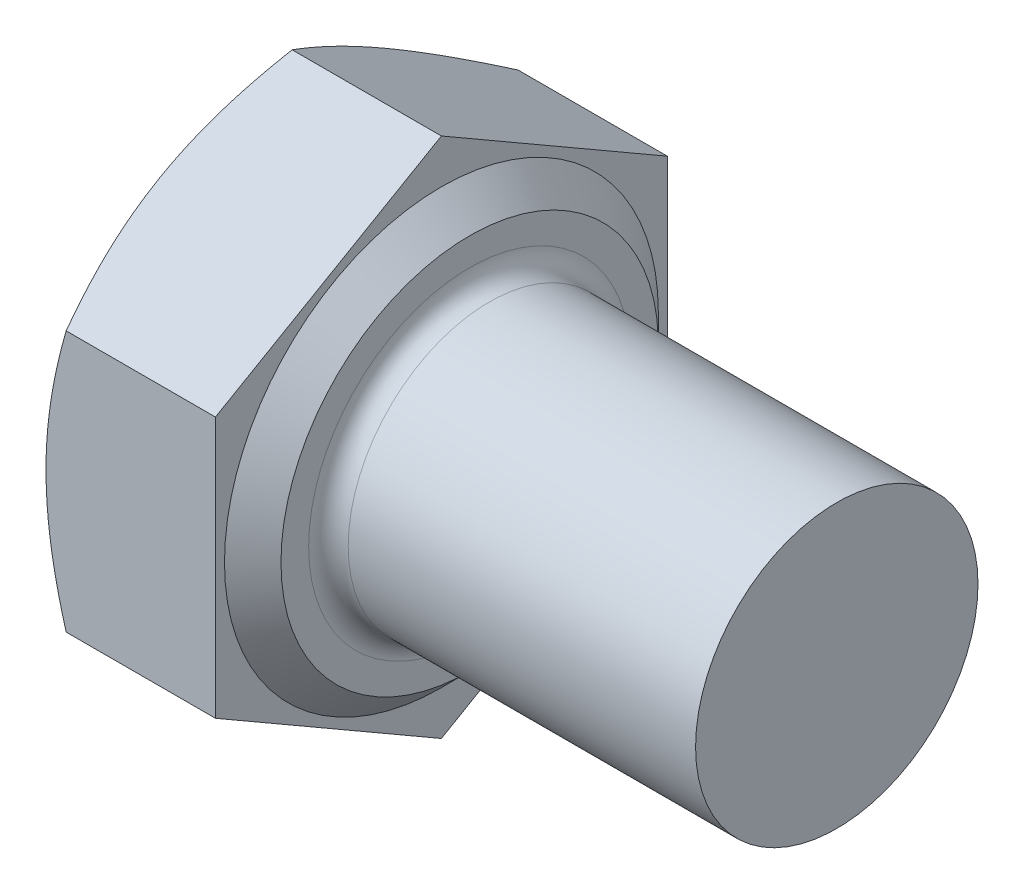
ISO-10303-21;
HEADER;
FILE_DESCRIPTION(('STEP AP214'),'2;1');
FILE_NAME('part.step','',(''),(''),'','','');
FILE_SCHEMA(('AUTOMOTIVE_DESIGN { 1 0 10303 214 1 1 1 1 }'));
ENDSEC;
DATA;
#1=APPLICATION_CONTEXT('core data for automotive mechanical design processes');
#2=APPLICATION_PROTOCOL_DEFINITION('international standard','automotive_design',2000,#1);
#3=PRODUCT_CONTEXT('',#1,'mechanical');
#4=PRODUCT('Part','Part','',(#3));
#5=PRODUCT_RELATED_PRODUCT_CATEGORY('part','',(#4));
#6=PRODUCT_DEFINITION_FORMATION('','',#4);
#7=PRODUCT_DEFINITION_CONTEXT('part definition',#1,'design');
#8=PRODUCT_DEFINITION('design','',#6,#7);
#9=PRODUCT_DEFINITION_SHAPE('','',#8);
#10=(LENGTH_UNIT() NAMED_UNIT(*) SI_UNIT(.MILLI.,.METRE.));
#11=(NAMED_UNIT(*) PLANE_ANGLE_UNIT() SI_UNIT($,.RADIAN.));
#12=(NAMED_UNIT(*) SI_UNIT($,.STERADIAN.) SOLID_ANGLE_UNIT());
#13=UNCERTAINTY_MEASURE_WITH_UNIT(LENGTH_MEASURE(1.E-05),#10,'distance_accuracy_value','');
#14=(GEOMETRIC_REPRESENTATION_CONTEXT(3) GLOBAL_UNCERTAINTY_ASSIGNED_CONTEXT((#13)) GLOBAL_UNIT_ASSIGNED_CONTEXT((#10,
#11,#12)) REPRESENTATION_CONTEXT('',''));
#15=CARTESIAN_POINT('',(0.,0.,0.));
#16=DIRECTION('',(0.,0.,1.));
#17=DIRECTION('',(1.,0.,0.));
#18=AXIS2_PLACEMENT_3D('',#15,#16,#17);
#19=CARTESIAN_POINT('',(3.5,2.30940107675851,-4.));
#20=DIRECTION('',(1.,0.,0.));
#21=DIRECTION('',(0.,0.,-1.));
#22=AXIS2_PLACEMENT_3D('',#19,#20,#21);
#23=PLANE('',#22);
#24=CARTESIAN_POINT('',(3.5,0.,0.));
#25=DIRECTION('',(-1.,0.,0.));
#26=DIRECTION('',(0.,0.,1.));
#27=AXIS2_PLACEMENT_3D('',#24,#25,#26);
#28=CIRCLE('',#27,2.85);
#29=CARTESIAN_POINT('',(3.5,0.,2.85));
#30=VERTEX_POINT('',#29);
#31=EDGE_CURVE('E264',#30,#30,#28,.T.);
#32=ORIENTED_EDGE('',*,*,#31,.T.);
#33=EDGE_LOOP('',(#32));
#34=FACE_BOUND('',#33,.T.);
#35=CARTESIAN_POINT('',(3.5,0.,0.));
#36=DIRECTION('',(-1.,0.,0.));
#37=DIRECTION('',(0.,0.,1.));
#38=AXIS2_PLACEMENT_3D('',#35,#36,#37);
#39=CIRCLE('',#38,3.34);
#40=CARTESIAN_POINT('',(3.5,0.,3.34));
#41=VERTEX_POINT('',#40);
#42=EDGE_CURVE('E267',#41,#41,#39,.T.);
#43=ORIENTED_EDGE('',*,*,#42,.F.);
#44=EDGE_LOOP('',(#43));
#45=FACE_BOUND('',#44,.T.);
#46=ADVANCED_FACE('F37',(#34,#45),#23,.T.);
#47=CARTESIAN_POINT('',(3.85000000000001,0.,0.));
#48=DIRECTION('',(-1.,0.,0.));
#49=DIRECTION('',(0.,0.,1.));
#50=AXIS2_PLACEMENT_3D('',#47,#48,#49);
#51=TOROIDAL_SURFACE('',#50,2.85,0.350000000000003);
#52=ORIENTED_EDGE('',*,*,#31,.F.);
#53=EDGE_LOOP('',(#52));
#54=FACE_BOUND('',#53,.T.);
#55=CARTESIAN_POINT('',(3.85000000000001,0.,0.));
#56=DIRECTION('',(-1.,0.,0.));
#57=DIRECTION('',(0.,0.,1.));
#58=AXIS2_PLACEMENT_3D('',#55,#56,#57);
#59=CIRCLE('',#58,2.5);
#60=CARTESIAN_POINT('',(3.85000000000001,0.,2.5));
#61=VERTEX_POINT('',#60);
#62=EDGE_CURVE('E123',#61,#61,#59,.T.);
#63=ORIENTED_EDGE('',*,*,#62,.T.);
#64=EDGE_LOOP('',(#63));
#65=FACE_BOUND('',#64,.T.);
#66=ADVANCED_FACE('F217',(#54,#65),#51,.F.);
#67=CARTESIAN_POINT('',(3.5,0.,0.));
#68=DIRECTION('',(-1.,0.,0.));
#69=DIRECTION('',(0.,0.,1.));
#70=AXIS2_PLACEMENT_3D('',#67,#68,#69);
#71=CYLINDRICAL_SURFACE('',#70,2.5);
#72=CARTESIAN_POINT('',(10.,0.,0.));
#73=DIRECTION('',(-1.,0.,0.));
#74=DIRECTION('',(0.,0.,1.));
#75=AXIS2_PLACEMENT_3D('',#72,#73,#74);
#76=CIRCLE('',#75,2.5);
#77=CARTESIAN_POINT('',(10.,0.,2.5));
#78=VERTEX_POINT('',#77);
#79=EDGE_CURVE('E11',#78,#78,#76,.T.);
#80=ORIENTED_EDGE('',*,*,#79,.T.);
#81=EDGE_LOOP('',(#80));
#82=FACE_BOUND('',#81,.T.);
#83=ORIENTED_EDGE('',*,*,#62,.F.);
#84=EDGE_LOOP('',(#83));
#85=FACE_BOUND('',#84,.T.);
#86=ADVANCED_FACE('F259',(#82,#85),#71,.T.);
#87=CARTESIAN_POINT('',(3.,-3.84,0.));
#88=DIRECTION('',(1.,0.,0.));
#89=DIRECTION('',(0.,0.,-1.));
#90=AXIS2_PLACEMENT_3D('',#87,#88,#89);
#91=PLANE('',#90);
#92=CARTESIAN_POINT('',(3.,0.,0.));
#93=DIRECTION('',(-1.,0.,0.));
#94=DIRECTION('',(0.,0.,1.));
#95=AXIS2_PLACEMENT_3D('',#92,#93,#94);
#96=CIRCLE('',#95,3.84);
#97=CARTESIAN_POINT('',(3.,0.,3.84));
#98=VERTEX_POINT('',#97);
#99=EDGE_CURVE('E269',#98,#98,#96,.T.);
#100=ORIENTED_EDGE('',*,*,#99,.T.);
#101=EDGE_LOOP('',(#100));
#102=FACE_BOUND('',#101,.T.);
#103=DIRECTION('',(0.,1.,0.));
#104=VECTOR('',#103,1.);
#105=CARTESIAN_POINT('',(3.,-2.30940107675854,-3.99999999999998));
#106=LINE('',#105,#104);
#107=CARTESIAN_POINT('',(3.,-2.30940107675854,-3.99999999999998));
#108=VERTEX_POINT('',#107);
#109=CARTESIAN_POINT('',(3.,2.30940107675851,-4.));
#110=VERTEX_POINT('',#109);
#111=EDGE_CURVE('E110',#108,#110,#106,.T.);
#112=ORIENTED_EDGE('',*,*,#111,.T.);
#113=DIRECTION('',(0.,0.5,0.866025403784439));
#114=VECTOR('',#113,1.);
#115=CARTESIAN_POINT('',(3.,2.30940107675851,-4.));
#116=LINE('',#115,#114);
#117=CARTESIAN_POINT('',(3.,4.61880215351701,0.));
#118=VERTEX_POINT('',#117);
#119=EDGE_CURVE('E124',#110,#118,#116,.T.);
#120=ORIENTED_EDGE('',*,*,#119,.T.);
#121=DIRECTION('',(0.,-0.499999999999999,0.866025403784439));
#122=VECTOR('',#121,1.);
#123=CARTESIAN_POINT('',(3.,4.61880215351701,0.));
#124=LINE('',#123,#122);
#125=CARTESIAN_POINT('',(3.,2.30940107675851,4.));
#126=VERTEX_POINT('',#125);
#127=EDGE_CURVE('E277',#118,#126,#124,.T.);
#128=ORIENTED_EDGE('',*,*,#127,.T.);
#129=DIRECTION('',(0.,-1.,0.));
#130=VECTOR('',#129,1.);
#131=CARTESIAN_POINT('',(3.,2.30940107675851,4.));
#132=LINE('',#131,#130);
#133=CARTESIAN_POINT('',(3.,-2.30940107675849,4.00000000000001));
#134=VERTEX_POINT('',#133);
#135=EDGE_CURVE('E275',#126,#134,#132,.T.);
#136=ORIENTED_EDGE('',*,*,#135,.T.);
#137=DIRECTION('',(0.,-0.500000000000001,-0.866025403784438));
#138=VECTOR('',#137,1.);
#139=CARTESIAN_POINT('',(3.,-2.30940107675849,4.00000000000001));
#140=LINE('',#139,#138);
#141=CARTESIAN_POINT('',(3.,-4.61880215351701,0.));
#142=VERTEX_POINT('',#141);
#143=EDGE_CURVE('E53',#134,#142,#140,.T.);
#144=ORIENTED_EDGE('',*,*,#143,.T.);
#145=DIRECTION('',(0.,0.499999999999997,-0.86602540378444));
#146=VECTOR('',#145,1.);
#147=CARTESIAN_POINT('',(3.,-4.61880215351701,0.));
#148=LINE('',#147,#146);
#149=EDGE_CURVE('E46',#142,#108,#148,.T.);
#150=ORIENTED_EDGE('',*,*,#149,.T.);
#151=EDGE_LOOP('',(#112,#120,#128,#136,#144,#150));
#152=FACE_BOUND('',#151,.T.);
#153=ADVANCED_FACE('F109',(#102,#152),#91,.T.);
#154=CARTESIAN_POINT('',(3.,0.,0.));
#155=DIRECTION('',(-1.,0.,0.));
#156=DIRECTION('',(0.,0.,1.));
#157=AXIS2_PLACEMENT_3D('',#154,#155,#156);
#158=CONICAL_SURFACE('',#157,3.84,0.785398163397442);
#159=ORIENTED_EDGE('',*,*,#42,.T.);
#160=EDGE_LOOP('',(#159));
#161=FACE_BOUND('',#160,.T.);
#162=ORIENTED_EDGE('',*,*,#99,.F.);
#163=EDGE_LOOP('',(#162));
#164=FACE_BOUND('',#163,.T.);
#165=ADVANCED_FACE('F303',(#161,#164),#158,.T.);
#166=CARTESIAN_POINT('',(0.,2.30940107675851,-4.));
#167=DIRECTION('',(1.,0.,0.));
#168=DIRECTION('',(0.,0.,-1.));
#169=AXIS2_PLACEMENT_3D('',#166,#167,#168);
#170=PLANE('',#169);
#171=CARTESIAN_POINT('',(0.,0.,0.));
#172=DIRECTION('',(1.,0.,0.));
#173=DIRECTION('',(0.,0.,-1.));
#174=AXIS2_PLACEMENT_3D('',#171,#172,#173);
#175=CIRCLE('',#174,4.);
#176=CARTESIAN_POINT('',(0.,0.,-4.));
#177=VERTEX_POINT('',#176);
#178=CARTESIAN_POINT('',(0.,3.46410161513775,-2.));
#179=VERTEX_POINT('',#178);
#180=EDGE_CURVE('E115',#177,#179,#175,.T.);
#181=ORIENTED_EDGE('',*,*,#180,.F.);
#182=CARTESIAN_POINT('',(0.,-3.46410161513777,-2.));
#183=VERTEX_POINT('',#182);
#184=EDGE_CURVE('E152',#183,#177,#175,.T.);
#185=ORIENTED_EDGE('',*,*,#184,.F.);
#186=CARTESIAN_POINT('',(0.,-3.46410161513775,2.));
#187=VERTEX_POINT('',#186);
#188=EDGE_CURVE('E154',#187,#183,#175,.T.);
#189=ORIENTED_EDGE('',*,*,#188,.F.);
#190=CARTESIAN_POINT('',(0.,0.,4.));
#191=VERTEX_POINT('',#190);
#192=EDGE_CURVE('E158',#191,#187,#175,.T.);
#193=ORIENTED_EDGE('',*,*,#192,.F.);
#194=CARTESIAN_POINT('',(0.,0.,0.));
#195=DIRECTION('',(-1.,0.,0.));
#196=DIRECTION('',(0.,0.,1.));
#197=AXIS2_PLACEMENT_3D('',#194,#195,#196);
#198=CIRCLE('',#197,4.);
#199=CARTESIAN_POINT('',(0.,3.46410161513775,2.));
#200=VERTEX_POINT('',#199);
#201=EDGE_CURVE('E199',#191,#200,#198,.T.);
#202=ORIENTED_EDGE('',*,*,#201,.T.);
#203=EDGE_CURVE('E159',#179,#200,#175,.T.);
#204=ORIENTED_EDGE('',*,*,#203,.F.);
#205=EDGE_LOOP('',(#181,#185,#189,#193,#202,#204));
#206=FACE_BOUND('',#205,.T.);
#207=ADVANCED_FACE('F177',(#206),#170,.F.);
#208=CARTESIAN_POINT('',(0.,0.,0.));
#209=DIRECTION('',(1.,0.,0.));
#210=DIRECTION('',(0.,0.,1.));
#211=AXIS2_PLACEMENT_3D('',#208,#209,#210);
#212=CONICAL_SURFACE('',#211,4.,1.0471975511966);
#213=CARTESIAN_POINT('',(0.35733225907477,4.61891762357085,0.00019999999999805));
#214=CARTESIAN_POINT('',(0.298717873648286,4.51743148381381,-0.175579150323231));
#215=CARTESIAN_POINT('',(0.245410321462266,4.41506932144052,-0.352875616326384));
#216=CARTESIAN_POINT('',(0.152361670746407,4.2085725054774,-0.710538593175709));
#217=CARTESIAN_POINT('',(0.112653489029708,4.10443418285647,-0.890911458970154));
#218=CARTESIAN_POINT('',(0.0508422152802831,3.89744813015756,-1.24942181870279));
#219=CARTESIAN_POINT('',(0.0283277315228931,3.7946322465506,-1.42750415293515));
#220=CARTESIAN_POINT('',(0.00145062314658626,3.58851671999023,-1.78450671716651));
#221=CARTESIAN_POINT('',(-0.00293425857305235,3.48521782616117,-1.9634256496441));
#222=CARTESIAN_POINT('',(0.00619007293997495,3.29219970504619,-2.29774284219674));
#223=CARTESIAN_POINT('',(0.0174589539879991,3.20245157692487,-2.45319115998707));
#224=CARTESIAN_POINT('',(0.0531739907981978,3.02354002635497,-2.76307505563506));
#225=CARTESIAN_POINT('',(0.0776323457115373,2.93437722268073,-2.91750956174413));
#226=CARTESIAN_POINT('',(0.138776064919293,2.75509682012355,-3.22803232777458));
#227=CARTESIAN_POINT('',(0.175720603654866,2.66500191089421,-3.3840812880631));
#228=CARTESIAN_POINT('',(0.259570072548029,2.48615580200001,-3.69385183540384));
#229=CARTESIAN_POINT('',(0.306455302212742,2.39740231122586,-3.84757739077378));
#230=CARTESIAN_POINT('',(0.357332259074768,2.30928560670467,-4.0002));
#231=B_SPLINE_CURVE_WITH_KNOTS('',3,(#213,#214,#215,#216,#217,#218,#219,#220,#221,#222,#223,
#224,#225,#226,#227,#228,#229,#230),.UNSPECIFIED.,.F.,.F.,(4,2,2,2,2,2,2,2,4),(0.,
0.634047835695966,1.26961969224543,1.88946157213122,2.50854226669297,3.04757825393386,
3.58711366126903,4.13861653143763,4.68903648037742),.UNSPECIFIED.);
#232=CARTESIAN_POINT('',(0.357265589908164,2.30940107675851,-4.));
#233=VERTEX_POINT('',#232);
#234=EDGE_CURVE('E187',#179,#233,#231,.T.);
#235=ORIENTED_EDGE('',*,*,#234,.T.);
#236=CARTESIAN_POINT('',(1.91949131906031,-6.13600787860014,-3.99999999999997));
#237=CARTESIAN_POINT('',(1.83453254114692,-5.96029824528281,-3.99999999999997));
#238=CARTESIAN_POINT('',(1.75041491774215,-5.78417443504921,-3.99999999999997));
#239=CARTESIAN_POINT('',(1.58434238711561,-5.43087457241901,-3.99999999999997));
#240=CARTESIAN_POINT('',(1.50238785174126,-5.25369834543672,-3.99999999999997));
#241=CARTESIAN_POINT('',(1.34069258944118,-4.89711815344377,-3.99999999999997));
#242=CARTESIAN_POINT('',(1.2609671107701,-4.71770724899219,-3.99999999999998));
#243=CARTESIAN_POINT('',(1.10492454769553,-4.35741495082771,-3.99999999999998));
#244=CARTESIAN_POINT('',(1.0286072865682,-4.17653363393527,-3.99999999999998));
#245=CARTESIAN_POINT('',(0.879359740575396,-3.81071561786163,-3.99999999999998));
#246=CARTESIAN_POINT('',(0.80648405731675,-3.62575651977364,-3.99999999999998));
#247=CARTESIAN_POINT('',(0.666412540786886,-3.25366068255849,-3.99999999999998));
#248=CARTESIAN_POINT('',(0.599217338066289,-3.06652370429613,-3.99999999999998));
#249=CARTESIAN_POINT('',(0.472304167658768,-2.69015503897306,-3.99999999999998));
#250=CARTESIAN_POINT('',(0.412570399692845,-2.50092873463207,-3.99999999999998));
#251=CARTESIAN_POINT('',(0.302512840080975,-2.11978551535808,-3.99999999999998));
#252=CARTESIAN_POINT('',(0.252186084020131,-1.92786946860207,-3.99999999999998));
#253=CARTESIAN_POINT('',(0.163379771912551,-1.54122028912674,-3.99999999999999));
#254=CARTESIAN_POINT('',(0.124902777698588,-1.34648655675811,-3.99999999999999));
#255=CARTESIAN_POINT('',(0.0623769826458263,-0.954658832260081,-3.99999999999999));
#256=CARTESIAN_POINT('',(0.0383281826610804,-0.757564839990973,-3.99999999999999));
#257=CARTESIAN_POINT('',(0.00678594419352145,-0.363304194123938,-3.99999999999999));
#258=CARTESIAN_POINT('',(-0.000813464833915623,-0.166146239239637,-3.99999999999999));
#259=CARTESIAN_POINT('',(0.000951740706278187,0.228050062110494,-3.99999999999999));
#260=CARTESIAN_POINT('',(0.0103118940041482,0.425088426396362,-3.99999999999999));
#261=CARTESIAN_POINT('',(0.040085248119804,0.761210581117507,-3.99999999999999));
#262=CARTESIAN_POINT('',(0.0565453952791145,0.900664377876312,-3.99999999999999));
#263=CARTESIAN_POINT('',(0.0968962874886259,1.17850220880597,-3.99999999999999));
#264=CARTESIAN_POINT('',(0.120788195049948,1.31688607213958,-3.99999999999999));
#265=CARTESIAN_POINT('',(0.202358575058061,1.73031595246286,-3.99999999999999));
#266=CARTESIAN_POINT('',(0.269910951597834,2.00343275055545,-4.));
#267=CARTESIAN_POINT('',(0.386514913879454,2.41213205945729,-4.));
#268=CARTESIAN_POINT('',(0.428526952638739,2.54984255586082,-4.));
#269=CARTESIAN_POINT('',(0.516731740349217,2.82382651940195,-4.));
#270=CARTESIAN_POINT('',(0.562921614665063,2.96010090367581,-4.));
#271=CARTESIAN_POINT('',(0.658519068779255,3.23064293966594,-4.));
#272=CARTESIAN_POINT('',(0.707907115663071,3.36491756386987,-4.));
#273=CARTESIAN_POINT('',(0.809597306890866,3.63242301131994,-4.));
#274=CARTESIAN_POINT('',(0.861900619604669,3.76565339130134,-4.));
#275=CARTESIAN_POINT('',(0.915374388530293,3.89840100612876,-4.));
#276=B_SPLINE_CURVE_WITH_KNOTS('',3,(#236,#237,#238,#239,#240,#241,#242,#243,#244,#245,#246,
#247,#248,#249,#250,#251,#252,#253,#254,#255,#256,#257,#258,#259,#260,#261,#262,#263,#264,#265,
#266,#267,#268,#269,#270,#271,#272,#273,#274,#275),.UNSPECIFIED.,.F.,.F.,(4,2,2,2,2,2,2,2,2,2,2,
2,2,2,2,2,2,2,2,4),(0.,0.585521951029805,1.17114390962969,1.76009774380607,2.34902100384485,
2.94534356731019,3.54173223771425,4.13683578232763,4.73175147568506,5.32679569536903,
5.92183995027563,6.51303924843911,7.10408305222163,7.52514324349571,7.94626933214689,
8.78914432607458,9.22103879153916,9.65263831261068,10.0818133381383,10.5111616212701),.UNSPECIFIED.);
#277=EDGE_CURVE('E185',#233,#177,#276,.F.);
#278=ORIENTED_EDGE('',*,*,#277,.T.);
#279=ORIENTED_EDGE('',*,*,#180,.T.);
#280=EDGE_LOOP('',(#235,#278,#279));
#281=FACE_BOUND('',#280,.T.);
#282=ADVANCED_FACE('F289',(#281),#212,.T.);
#283=CARTESIAN_POINT('',(0.357332259074769,2.30928560670467,4.0002));
#284=CARTESIAN_POINT('',(0.298717873648285,2.41077174646171,3.82442084967677));
#285=CARTESIAN_POINT('',(0.245410321462265,2.513133908835,3.64712438367362));
#286=CARTESIAN_POINT('',(0.152361670746406,2.71963072479812,3.28946140682429));
#287=CARTESIAN_POINT('',(0.112653489029707,2.82376904741905,3.10908854102984));
#288=CARTESIAN_POINT('',(0.0508422152802822,3.03075510011796,2.75057818129721));
#289=CARTESIAN_POINT('',(0.0283277315228925,3.13357098372492,2.57249584706485));
#290=CARTESIAN_POINT('',(0.0014506231465858,3.33968651028529,2.21549328283349));
#291=CARTESIAN_POINT('',(-0.00293425857305308,3.44298540411435,2.03657435035589));
#292=CARTESIAN_POINT('',(0.00619007293997406,3.63600352522933,1.70225715780326));
#293=CARTESIAN_POINT('',(0.0174589539879983,3.72575165335065,1.54680884001293));
#294=CARTESIAN_POINT('',(0.0531739907981973,3.90466320392055,1.23692494436494));
#295=CARTESIAN_POINT('',(0.0776323457115371,3.99382600759479,1.08249043825587));
#296=CARTESIAN_POINT('',(0.138776064919293,4.17310641015198,0.771967672225418));
#297=CARTESIAN_POINT('',(0.175720603654867,4.26320131938132,0.615918711936894));
#298=CARTESIAN_POINT('',(0.25957007254803,4.44204742827551,0.306148164596158));
#299=CARTESIAN_POINT('',(0.306455302212743,4.53080091904967,0.152422609226218));
#300=CARTESIAN_POINT('',(0.35733225907477,4.61891762357085,-0.000200000000001869));
#301=B_SPLINE_CURVE_WITH_KNOTS('',3,(#283,#284,#285,#286,#287,#288,#289,#290,#291,#292,#293,
#294,#295,#296,#297,#298,#299,#300),.UNSPECIFIED.,.F.,.F.,(4,2,2,2,2,2,2,2,4),(0.,
0.634047835695965,1.26961969224543,1.88946157213122,2.50854226669297,3.04757825393386,
3.58711366126903,4.13861653143763,4.68903648037743),.UNSPECIFIED.);
#302=CARTESIAN_POINT('',(0.357265589908166,4.61880215351701,0.));
#303=VERTEX_POINT('',#302);
#304=EDGE_CURVE('E136',#200,#303,#301,.T.);
#305=ORIENTED_EDGE('',*,*,#304,.T.);
#306=EDGE_CURVE('E61',#303,#179,#231,.T.);
#307=ORIENTED_EDGE('',*,*,#306,.T.);
#308=ORIENTED_EDGE('',*,*,#203,.T.);
#309=EDGE_LOOP('',(#305,#307,#308));
#310=FACE_BOUND('',#309,.T.);
#311=ADVANCED_FACE('F214',(#310),#212,.T.);
#312=CARTESIAN_POINT('',(0.357265589908164,2.30940107675851,4.));
#313=VERTEX_POINT('',#312);
#314=EDGE_CURVE('E132',#313,#200,#301,.T.);
#315=ORIENTED_EDGE('',*,*,#314,.T.);
#316=ORIENTED_EDGE('',*,*,#201,.F.);
#317=CARTESIAN_POINT('',(1.91949120646931,-6.13600764580939,4.00000000000002));
#318=CARTESIAN_POINT('',(1.83453243337032,-5.96029802046226,4.00000000000002));
#319=CARTESIAN_POINT('',(1.75041481477709,-5.78417421820494,4.00000000000002));
#320=CARTESIAN_POINT('',(1.58434229374799,-5.43087437155386,4.00000000000002));
#321=CARTESIAN_POINT('',(1.50238776315955,-5.25369815257442,4.00000000000002));
#322=CARTESIAN_POINT('',(1.34069251043344,-4.89711797672013,4.00000000000002));
#323=CARTESIAN_POINT('',(1.26096703654941,-4.71770708040489,4.00000000000002));
#324=CARTESIAN_POINT('',(1.10492448296113,-4.35741479857339,4.00000000000002));
#325=CARTESIAN_POINT('',(1.02860722653305,-4.17653348987757,4.00000000000002));
#326=CARTESIAN_POINT('',(0.879359689861999,-3.81071549042518,4.00000000000002));
#327=CARTESIAN_POINT('',(0.806484011223184,-3.62575640076333,4.00000000000002));
#328=CARTESIAN_POINT('',(0.666412503677517,-3.25366058054104,4.00000000000001));
#329=CARTESIAN_POINT('',(0.599217305321195,-3.06652361084543,4.00000000000001));
#330=CARTESIAN_POINT('',(0.472304143209208,-2.69015496281749,4.00000000000001));
#331=CARTESIAN_POINT('',(0.412570379175942,-2.5009286672043,4.00000000000001));
#332=CARTESIAN_POINT('',(0.302512826766215,-2.1197854656258,4.00000000000001));
#333=CARTESIAN_POINT('',(0.252186073975287,-1.92786942783734,4.00000000000001));
#334=CARTESIAN_POINT('',(0.163379768486074,-1.54122027124256,4.00000000000001));
#335=CARTESIAN_POINT('',(0.124902777334436,-1.34648655285392,4.00000000000001));
#336=CARTESIAN_POINT('',(0.0623769862766003,-0.954658856631734,4.00000000000001));
#337=CARTESIAN_POINT('',(0.0383281872259856,-0.757564878658228,4.00000000000001));
#338=CARTESIAN_POINT('',(0.00678594810879021,-0.363304261313727,4.));
#339=CARTESIAN_POINT('',(-0.000813462481064327,-0.16614632065538,4.));
#340=CARTESIAN_POINT('',(0.000951737499979277,0.22804995248298,4.));
#341=CARTESIAN_POINT('',(0.0103118868006022,0.425088302782968,4.));
#342=CARTESIAN_POINT('',(0.0400852329091964,0.761210439648584,4.));
#343=CARTESIAN_POINT('',(0.0565453768668471,0.900664232381911,4.));
#344=CARTESIAN_POINT('',(0.0968962624971283,1.17850205543051,4.));
#345=CARTESIAN_POINT('',(0.120788166680851,1.31688591490858,4.));
#346=CARTESIAN_POINT('',(0.202358536474655,1.73031578385203,4.));
#347=CARTESIAN_POINT('',(0.269910906102915,2.00343257463138,4.));
#348=CARTESIAN_POINT('',(0.386514858161894,2.41213187260233,4.));
#349=CARTESIAN_POINT('',(0.428526893488739,2.54984236530054,4.));
#350=CARTESIAN_POINT('',(0.51673167443411,2.82382632147354,3.99999999999999));
#351=CARTESIAN_POINT('',(0.562921545417337,2.96010070208453,3.99999999999999));
#352=CARTESIAN_POINT('',(0.658518992997691,3.23064273080269,3.99999999999999));
#353=CARTESIAN_POINT('',(0.707907036680203,3.36491735139727,3.99999999999999));
#354=CARTESIAN_POINT('',(0.809597221602637,3.63242279162073,3.99999999999999));
#355=CARTESIAN_POINT('',(0.861900531212279,3.76565316798494,3.99999999999999));
#356=CARTESIAN_POINT('',(0.915374297081839,3.89840077918901,3.99999999999999));
#357=B_SPLINE_CURVE_WITH_KNOTS('',3,(#317,#318,#319,#320,#321,#322,#323,#324,#325,#326,#327,
#328,#329,#330,#331,#332,#333,#334,#335,#336,#337,#338,#339,#340,#341,#342,#343,#344,#345,#346,
#347,#348,#349,#350,#351,#352,#353,#354,#355,#356),.UNSPECIFIED.,.F.,.F.,(4,2,2,2,2,2,2,2,2,2,2,
2,2,2,2,2,2,2,2,4),(0.,0.585521923216113,1.17114385399772,1.76009766003639,2.3490208919397,
2.94534342680831,3.54173206860598,4.13683558471493,4.73175124959096,5.32679542644494,
5.92183963858471,6.51303889444524,7.10408265589568,7.52514283405346,7.94626890958621,
8.78914387720299,9.22103832902587,9.6526378364765,10.0818128485231,10.5111611181472),.UNSPECIFIED.);
#358=EDGE_CURVE('E189',#191,#313,#357,.T.);
#359=ORIENTED_EDGE('',*,*,#358,.T.);
#360=EDGE_LOOP('',(#315,#316,#359));
#361=FACE_BOUND('',#360,.T.);
#362=ADVANCED_FACE('F209',(#361),#212,.T.);
#363=CARTESIAN_POINT('',(0.357265589908165,-2.30940107675849,4.00000000000001));
#364=VERTEX_POINT('',#363);
#365=EDGE_CURVE('E173',#364,#191,#357,.T.);
#366=ORIENTED_EDGE('',*,*,#365,.T.);
#367=ORIENTED_EDGE('',*,*,#192,.T.);
#368=CARTESIAN_POINT('',(0.357332259074769,-4.61891762357085,-0.000200000000004817));
#369=CARTESIAN_POINT('',(0.298717873648285,-4.51743148381381,0.175579150323223));
#370=CARTESIAN_POINT('',(0.245410321462265,-4.41506932144052,0.352875616326376));
#371=CARTESIAN_POINT('',(0.152361670746406,-4.2085725054774,0.710538593175702));
#372=CARTESIAN_POINT('',(0.112653489029706,-4.10443418285647,0.890911458970146));
#373=CARTESIAN_POINT('',(0.0508422152802806,-3.89744813015756,1.24942181870279));
#374=CARTESIAN_POINT('',(0.0283277315228898,-3.79463224655059,1.42750415293514));
#375=CARTESIAN_POINT('',(0.00145062314658228,-3.58851671999023,1.7845067171665));
#376=CARTESIAN_POINT('',(-0.00293425857305625,-3.48521782616117,1.96342564964409));
#377=CARTESIAN_POINT('',(0.00619007293997031,-3.29219970504619,2.29774284219673));
#378=CARTESIAN_POINT('',(0.0174589539879939,-3.20245157692486,2.45319115998706));
#379=CARTESIAN_POINT('',(0.0531739907981924,-3.02354002635496,2.76307505563505));
#380=CARTESIAN_POINT('',(0.0776323457115322,-2.93437722268072,2.91750956174413));
#381=CARTESIAN_POINT('',(0.138776064919289,-2.75509682012353,3.22803232777458));
#382=CARTESIAN_POINT('',(0.175720603654864,-2.66500191089419,3.38408128806311));
#383=CARTESIAN_POINT('',(0.259570072548029,-2.486155802,3.69385183540385));
#384=CARTESIAN_POINT('',(0.306455302212743,-2.39740231122584,3.84757739077379));
#385=CARTESIAN_POINT('',(0.357332259074769,-2.30928560670465,4.00020000000001));
#386=B_SPLINE_CURVE_WITH_KNOTS('',3,(#368,#369,#370,#371,#372,#373,#374,#375,#376,#377,#378,
#379,#380,#381,#382,#383,#384,#385),.UNSPECIFIED.,.F.,.F.,(4,2,2,2,2,2,2,2,4),(0.,
0.634047835695966,1.26961969224543,1.88946157213122,2.50854226669297,3.04757825393386,
3.58711366126904,4.13861653143765,4.68903648037745),.UNSPECIFIED.);
#387=EDGE_CURVE('E171',#187,#364,#386,.T.);
#388=ORIENTED_EDGE('',*,*,#387,.T.);
#389=EDGE_LOOP('',(#366,#367,#388));
#390=FACE_BOUND('',#389,.T.);
#391=ADVANCED_FACE('F169',(#390),#212,.T.);
#392=CARTESIAN_POINT('',(0.357265589908165,-2.30940107675854,-3.99999999999998));
#393=VERTEX_POINT('',#392);
#394=EDGE_CURVE('E190',#177,#393,#276,.F.);
#395=ORIENTED_EDGE('',*,*,#394,.T.);
#396=CARTESIAN_POINT('',(0.357332259074769,-2.3092856067047,-4.00019999999998));
#397=CARTESIAN_POINT('',(0.298717873648285,-2.41077174646174,-3.82442084967675));
#398=CARTESIAN_POINT('',(0.245410321462266,-2.51313390883503,-3.6471243836736));
#399=CARTESIAN_POINT('',(0.152361670746408,-2.71963072479815,-3.28946140682427));
#400=CARTESIAN_POINT('',(0.112653489029709,-2.82376904741907,-3.10908854102983));
#401=CARTESIAN_POINT('',(0.0508422152802854,-3.03075510011798,-2.75057818129719));
#402=CARTESIAN_POINT('',(0.028327731522896,-3.13357098372495,-2.57249584706484));
#403=CARTESIAN_POINT('',(0.00145062314659007,-3.33968651028531,-2.21549328283347));
#404=CARTESIAN_POINT('',(-0.00293425857304821,-3.44298540411437,-2.03657435035588));
#405=CARTESIAN_POINT('',(0.00619007293997994,-3.63600352522935,-1.70225715780325));
#406=CARTESIAN_POINT('',(0.0174589539880044,-3.72575165335067,-1.54680884001292));
#407=CARTESIAN_POINT('',(0.0531739907982031,-3.90466320392056,-1.23692494436493));
#408=CARTESIAN_POINT('',(0.0776323457115423,-3.9938260075948,-1.08249043825586));
#409=CARTESIAN_POINT('',(0.138776064919297,-4.17310641015198,-0.771967672225415));
#410=CARTESIAN_POINT('',(0.175720603654871,-4.26320131938132,-0.615918711936893));
#411=CARTESIAN_POINT('',(0.259570072548033,-4.44204742827551,-0.306148164596161));
#412=CARTESIAN_POINT('',(0.306455302212745,-4.53080091904967,-0.152422609226223));
#413=CARTESIAN_POINT('',(0.35733225907477,-4.61891762357085,0.000199999999995354));
#414=B_SPLINE_CURVE_WITH_KNOTS('',3,(#396,#397,#398,#399,#400,#401,#402,#403,#404,#405,#406,
#407,#408,#409,#410,#411,#412,#413),.UNSPECIFIED.,.F.,.F.,(4,2,2,2,2,2,2,2,4),(0.,
0.634047835695966,1.26961969224543,1.88946157213122,2.50854226669297,3.04757825393385,
3.58711366126902,4.13861653143761,4.6890364803774),.UNSPECIFIED.);
#415=EDGE_CURVE('E130',#393,#183,#414,.T.);
#416=ORIENTED_EDGE('',*,*,#415,.T.);
#417=ORIENTED_EDGE('',*,*,#184,.T.);
#418=EDGE_LOOP('',(#395,#416,#417));
#419=FACE_BOUND('',#418,.T.);
#420=ADVANCED_FACE('F290',(#419),#212,.T.);
#421=CARTESIAN_POINT('',(0.357265589908166,-4.61880215351701,0.));
#422=VERTEX_POINT('',#421);
#423=EDGE_CURVE('E183',#422,#187,#386,.T.);
#424=ORIENTED_EDGE('',*,*,#423,.T.);
#425=ORIENTED_EDGE('',*,*,#188,.T.);
#426=EDGE_CURVE('E198',#183,#422,#414,.T.);
#427=ORIENTED_EDGE('',*,*,#426,.T.);
#428=EDGE_LOOP('',(#424,#425,#427));
#429=FACE_BOUND('',#428,.T.);
#430=ADVANCED_FACE('F216',(#429),#212,.T.);
#431=CARTESIAN_POINT('',(3.5,-4.61880215351701,0.));
#432=DIRECTION('',(0.,0.86602540378444,0.499999999999997));
#433=DIRECTION('',(0.,-0.499999999999997,0.86602540378444));
#434=AXIS2_PLACEMENT_3D('',#431,#432,#433);
#435=PLANE('',#434);
#436=ORIENTED_EDGE('',*,*,#149,.F.);
#437=DIRECTION('',(-1.,0.,0.));
#438=VECTOR('',#437,1.);
#439=CARTESIAN_POINT('',(3.5,-4.61880215351701,0.));
#440=LINE('',#439,#438);
#441=EDGE_CURVE('E131',#142,#422,#440,.T.);
#442=ORIENTED_EDGE('',*,*,#441,.T.);
#443=ORIENTED_EDGE('',*,*,#426,.F.);
#444=ORIENTED_EDGE('',*,*,#415,.F.);
#445=DIRECTION('',(-1.,0.,0.));
#446=VECTOR('',#445,1.);
#447=CARTESIAN_POINT('',(3.5,-2.30940107675854,-3.99999999999998));
#448=LINE('',#447,#446);
#449=EDGE_CURVE('E119',#108,#393,#448,.T.);
#450=ORIENTED_EDGE('',*,*,#449,.F.);
#451=EDGE_LOOP('',(#436,#442,#443,#444,#450));
#452=FACE_BOUND('',#451,.T.);
#453=ADVANCED_FACE('F127',(#452),#435,.F.);
#454=CARTESIAN_POINT('',(3.5,-2.30940107675849,4.00000000000001));
#455=DIRECTION('',(0.,0.866025403784438,-0.500000000000001));
#456=DIRECTION('',(0.,0.500000000000001,0.866025403784438));
#457=AXIS2_PLACEMENT_3D('',#454,#455,#456);
#458=PLANE('',#457);
#459=ORIENTED_EDGE('',*,*,#143,.F.);
#460=DIRECTION('',(-1.,0.,0.));
#461=VECTOR('',#460,1.);
#462=CARTESIAN_POINT('',(3.5,-2.30940107675849,4.00000000000001));
#463=LINE('',#462,#461);
#464=EDGE_CURVE('E134',#134,#364,#463,.T.);
#465=ORIENTED_EDGE('',*,*,#464,.T.);
#466=ORIENTED_EDGE('',*,*,#387,.F.);
#467=ORIENTED_EDGE('',*,*,#423,.F.);
#468=ORIENTED_EDGE('',*,*,#441,.F.);
#469=EDGE_LOOP('',(#459,#465,#466,#467,#468));
#470=FACE_BOUND('',#469,.T.);
#471=ADVANCED_FACE('F182',(#470),#458,.F.);
#472=CARTESIAN_POINT('',(3.5,2.30940107675851,4.));
#473=DIRECTION('',(0.,0.,-1.));
#474=DIRECTION('',(0.,1.,0.));
#475=AXIS2_PLACEMENT_3D('',#472,#473,#474);
#476=PLANE('',#475);
#477=ORIENTED_EDGE('',*,*,#135,.F.);
#478=DIRECTION('',(-1.,0.,0.));
#479=VECTOR('',#478,1.);
#480=CARTESIAN_POINT('',(3.5,2.30940107675851,4.));
#481=LINE('',#480,#479);
#482=EDGE_CURVE('E147',#126,#313,#481,.T.);
#483=ORIENTED_EDGE('',*,*,#482,.T.);
#484=ORIENTED_EDGE('',*,*,#358,.F.);
#485=ORIENTED_EDGE('',*,*,#365,.F.);
#486=ORIENTED_EDGE('',*,*,#464,.F.);
#487=EDGE_LOOP('',(#477,#483,#484,#485,#486));
#488=FACE_BOUND('',#487,.T.);
#489=ADVANCED_FACE('F244',(#488),#476,.F.);
#490=CARTESIAN_POINT('',(3.5,4.61880215351701,0.));
#491=DIRECTION('',(0.,-0.866025403784439,-0.499999999999999));
#492=DIRECTION('',(0.,0.499999999999999,-0.866025403784439));
#493=AXIS2_PLACEMENT_3D('',#490,#491,#492);
#494=PLANE('',#493);
#495=ORIENTED_EDGE('',*,*,#127,.F.);
#496=DIRECTION('',(-1.,0.,0.));
#497=VECTOR('',#496,1.);
#498=CARTESIAN_POINT('',(3.5,4.61880215351701,0.));
#499=LINE('',#498,#497);
#500=EDGE_CURVE('E149',#118,#303,#499,.T.);
#501=ORIENTED_EDGE('',*,*,#500,.T.);
#502=ORIENTED_EDGE('',*,*,#304,.F.);
#503=ORIENTED_EDGE('',*,*,#314,.F.);
#504=ORIENTED_EDGE('',*,*,#482,.F.);
#505=EDGE_LOOP('',(#495,#501,#502,#503,#504));
#506=FACE_BOUND('',#505,.T.);
#507=ADVANCED_FACE('F240',(#506),#494,.F.);
#508=CARTESIAN_POINT('',(3.5,2.30940107675851,-4.));
#509=DIRECTION('',(0.,-0.866025403784439,0.5));
#510=DIRECTION('',(0.,-0.5,-0.866025403784439));
#511=AXIS2_PLACEMENT_3D('',#508,#509,#510);
#512=PLANE('',#511);
#513=ORIENTED_EDGE('',*,*,#119,.F.);
#514=DIRECTION('',(-1.,0.,0.));
#515=VECTOR('',#514,1.);
#516=CARTESIAN_POINT('',(3.5,2.30940107675851,-4.));
#517=LINE('',#516,#515);
#518=EDGE_CURVE('E122',#110,#233,#517,.T.);
#519=ORIENTED_EDGE('',*,*,#518,.T.);
#520=ORIENTED_EDGE('',*,*,#234,.F.);
#521=ORIENTED_EDGE('',*,*,#306,.F.);
#522=ORIENTED_EDGE('',*,*,#500,.F.);
#523=EDGE_LOOP('',(#513,#519,#520,#521,#522));
#524=FACE_BOUND('',#523,.T.);
#525=ADVANCED_FACE('F237',(#524),#512,.F.);
#526=CARTESIAN_POINT('',(3.5,-2.30940107675854,-3.99999999999998));
#527=DIRECTION('',(0.,0.,1.));
#528=DIRECTION('',(0.,-1.,0.));
#529=AXIS2_PLACEMENT_3D('',#526,#527,#528);
#530=PLANE('',#529);
#531=ORIENTED_EDGE('',*,*,#111,.F.);
#532=ORIENTED_EDGE('',*,*,#449,.T.);
#533=ORIENTED_EDGE('',*,*,#394,.F.);
#534=ORIENTED_EDGE('',*,*,#277,.F.);
#535=ORIENTED_EDGE('',*,*,#518,.F.);
#536=EDGE_LOOP('',(#531,#532,#533,#534,#535));
#537=FACE_BOUND('',#536,.T.);
#538=ADVANCED_FACE('F39',(#537),#530,.F.);
#539=CARTESIAN_POINT('',(10.,-2.5,-5.));
#540=DIRECTION('',(-1.,0.,0.));
#541=DIRECTION('',(0.,0.,1.));
#542=AXIS2_PLACEMENT_3D('',#539,#540,#541);
#543=PLANE('',#542);
#544=ORIENTED_EDGE('',*,*,#79,.F.);
#545=EDGE_LOOP('',(#544));
#546=FACE_BOUND('',#545,.T.);
#547=ADVANCED_FACE('F315',(#546),#543,.F.);
#548=CLOSED_SHELL('',(#46,#66,#86,#153,#165,#207,#282,#311,#362,#391,#420,#430,#453,#471,#489,
#507,#525,#538,#547));
#549=MANIFOLD_SOLID_BREP('B2',#548);
#550=ADVANCED_BREP_SHAPE_REPRESENTATION('',(#18,#549),#14);
#551=SHAPE_DEFINITION_REPRESENTATION(#9,#550);
ENDSEC;
END-ISO-10303-21;
